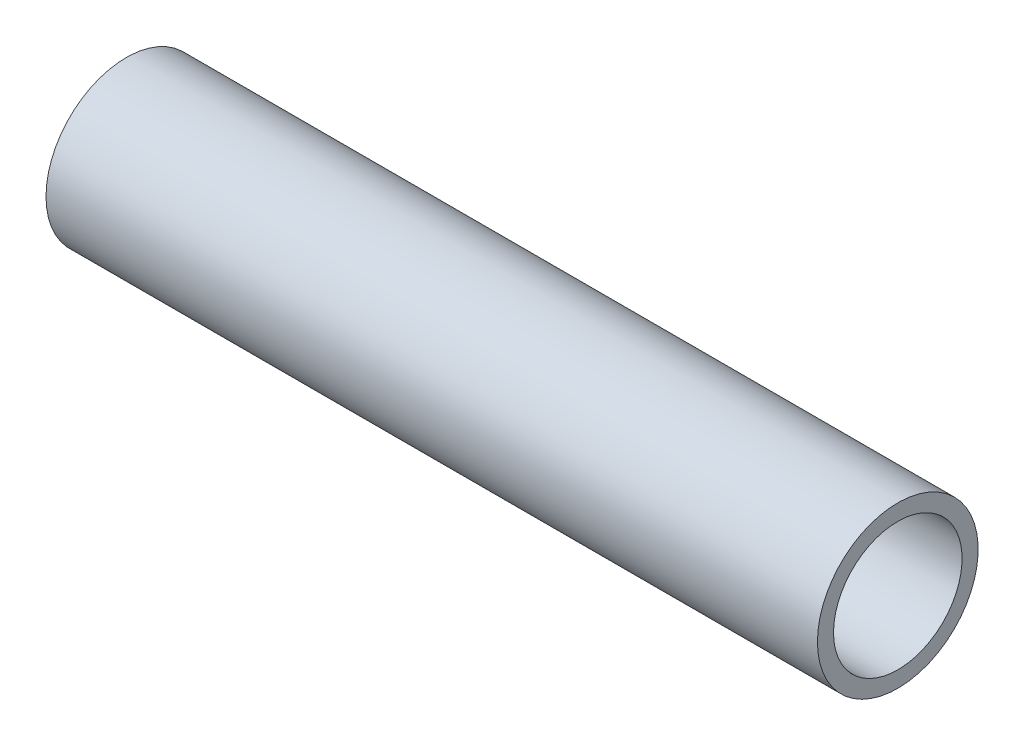
ISO-10303-21;
HEADER;
FILE_DESCRIPTION(('STEP AP214'),'2;1');
FILE_NAME('part.step','',(''),(''),'','','');
FILE_SCHEMA(('AUTOMOTIVE_DESIGN { 1 0 10303 214 1 1 1 1 }'));
ENDSEC;
DATA;
#1=APPLICATION_CONTEXT('core data for automotive mechanical design processes');
#2=APPLICATION_PROTOCOL_DEFINITION('international standard','automotive_design',2000,#1);
#3=PRODUCT_CONTEXT('',#1,'mechanical');
#4=PRODUCT('Part','Part','',(#3));
#5=PRODUCT_RELATED_PRODUCT_CATEGORY('part','',(#4));
#6=PRODUCT_DEFINITION_FORMATION('','',#4);
#7=PRODUCT_DEFINITION_CONTEXT('part definition',#1,'design');
#8=PRODUCT_DEFINITION('design','',#6,#7);
#9=PRODUCT_DEFINITION_SHAPE('','',#8);
#10=(LENGTH_UNIT() NAMED_UNIT(*) SI_UNIT(.MILLI.,.METRE.));
#11=(NAMED_UNIT(*) PLANE_ANGLE_UNIT() SI_UNIT($,.RADIAN.));
#12=(NAMED_UNIT(*) SI_UNIT($,.STERADIAN.) SOLID_ANGLE_UNIT());
#13=UNCERTAINTY_MEASURE_WITH_UNIT(LENGTH_MEASURE(1.E-05),#10,'distance_accuracy_value','');
#14=(GEOMETRIC_REPRESENTATION_CONTEXT(3) GLOBAL_UNCERTAINTY_ASSIGNED_CONTEXT((#13)) GLOBAL_UNIT_ASSIGNED_CONTEXT((#10,
#11,#12)) REPRESENTATION_CONTEXT('',''));
#15=CARTESIAN_POINT('',(0.,0.,0.));
#16=DIRECTION('',(0.,0.,1.));
#17=DIRECTION('',(1.,0.,0.));
#18=AXIS2_PLACEMENT_3D('',#15,#16,#17);
#19=CARTESIAN_POINT('',(38.1,0.,0.));
#20=DIRECTION('',(1.,0.,0.));
#21=DIRECTION('',(0.,0.,-1.));
#22=AXIS2_PLACEMENT_3D('',#19,#20,#21);
#23=PLANE('',#22);
#24=CARTESIAN_POINT('',(38.1,0.,0.));
#25=DIRECTION('',(1.,0.,0.));
#26=DIRECTION('',(0.,0.,-1.));
#27=AXIS2_PLACEMENT_3D('',#24,#25,#26);
#28=CIRCLE('',#27,7.9375);
#29=CARTESIAN_POINT('',(38.1,0.,7.9375));
#30=VERTEX_POINT('',#29);
#31=EDGE_CURVE('E10',#30,#30,#28,.T.);
#32=ORIENTED_EDGE('',*,*,#31,.T.);
#33=EDGE_LOOP('',(#32));
#34=FACE_BOUND('',#33,.T.);
#35=CARTESIAN_POINT('',(38.1,0.,0.));
#36=DIRECTION('',(1.,0.,0.));
#37=DIRECTION('',(0.,0.,-1.));
#38=AXIS2_PLACEMENT_3D('',#35,#36,#37);
#39=CIRCLE('',#38,6.35);
#40=CARTESIAN_POINT('',(38.1,0.,6.35));
#41=VERTEX_POINT('',#40);
#42=EDGE_CURVE('E54',#41,#41,#39,.T.);
#43=ORIENTED_EDGE('',*,*,#42,.F.);
#44=EDGE_LOOP('',(#43));
#45=FACE_BOUND('',#44,.T.);
#46=ADVANCED_FACE('F41',(#34,#45),#23,.T.);
#47=CARTESIAN_POINT('',(-38.1,0.,0.));
#48=DIRECTION('',(1.,0.,0.));
#49=DIRECTION('',(0.,0.,-1.));
#50=AXIS2_PLACEMENT_3D('',#47,#48,#49);
#51=PLANE('',#50);
#52=CARTESIAN_POINT('',(-38.1,0.,0.));
#53=DIRECTION('',(1.,0.,0.));
#54=DIRECTION('',(0.,0.,-1.));
#55=AXIS2_PLACEMENT_3D('',#52,#53,#54);
#56=CIRCLE('',#55,7.9375);
#57=CARTESIAN_POINT('',(-38.1,0.,7.9375));
#58=VERTEX_POINT('',#57);
#59=EDGE_CURVE('E45',#58,#58,#56,.T.);
#60=ORIENTED_EDGE('',*,*,#59,.F.);
#61=EDGE_LOOP('',(#60));
#62=FACE_BOUND('',#61,.T.);
#63=CARTESIAN_POINT('',(-38.1,0.,0.));
#64=DIRECTION('',(1.,0.,0.));
#65=DIRECTION('',(0.,0.,-1.));
#66=AXIS2_PLACEMENT_3D('',#63,#64,#65);
#67=CIRCLE('',#66,6.35);
#68=CARTESIAN_POINT('',(-38.1,0.,6.35));
#69=VERTEX_POINT('',#68);
#70=EDGE_CURVE('E56',#69,#69,#67,.T.);
#71=ORIENTED_EDGE('',*,*,#70,.T.);
#72=EDGE_LOOP('',(#71));
#73=FACE_BOUND('',#72,.T.);
#74=ADVANCED_FACE('F68',(#62,#73),#51,.F.);
#75=CARTESIAN_POINT('',(38.1,0.,0.));
#76=DIRECTION('',(-1.,0.,0.));
#77=DIRECTION('',(0.,0.,1.));
#78=AXIS2_PLACEMENT_3D('',#75,#76,#77);
#79=CYLINDRICAL_SURFACE('',#78,7.9375);
#80=CARTESIAN_POINT('',(38.1,0.,7.9375));
#81=CARTESIAN_POINT('',(37.30625,0.,7.9375));
#82=CARTESIAN_POINT('',(36.5125,0.,7.9375));
#83=CARTESIAN_POINT('',(34.925,0.,7.9375));
#84=CARTESIAN_POINT('',(34.13125,0.,7.9375));
#85=CARTESIAN_POINT('',(32.54375,0.,7.9375));
#86=CARTESIAN_POINT('',(31.75,0.,7.9375));
#87=CARTESIAN_POINT('',(30.1625,0.,7.9375));
#88=CARTESIAN_POINT('',(29.36875,0.,7.9375));
#89=CARTESIAN_POINT('',(27.78125,0.,7.9375));
#90=CARTESIAN_POINT('',(26.9875,0.,7.9375));
#91=CARTESIAN_POINT('',(25.4,0.,7.9375));
#92=CARTESIAN_POINT('',(24.60625,0.,7.9375));
#93=CARTESIAN_POINT('',(23.01875,0.,7.9375));
#94=CARTESIAN_POINT('',(22.225,0.,7.9375));
#95=CARTESIAN_POINT('',(20.6375,0.,7.9375));
#96=CARTESIAN_POINT('',(19.84375,0.,7.9375));
#97=CARTESIAN_POINT('',(18.25625,0.,7.9375));
#98=CARTESIAN_POINT('',(17.4625,0.,7.9375));
#99=CARTESIAN_POINT('',(15.875,0.,7.9375));
#100=CARTESIAN_POINT('',(15.08125,0.,7.9375));
#101=CARTESIAN_POINT('',(13.49375,0.,7.9375));
#102=CARTESIAN_POINT('',(12.7,0.,7.9375));
#103=CARTESIAN_POINT('',(11.1125,0.,7.9375));
#104=CARTESIAN_POINT('',(10.31875,0.,7.9375));
#105=CARTESIAN_POINT('',(8.73124999999999,0.,7.9375));
#106=CARTESIAN_POINT('',(7.93749999999999,0.,7.9375));
#107=CARTESIAN_POINT('',(6.34999999999999,0.,7.9375));
#108=CARTESIAN_POINT('',(5.55625,0.,7.9375));
#109=CARTESIAN_POINT('',(3.96875,0.,7.9375));
#110=CARTESIAN_POINT('',(3.17499999999999,0.,7.9375));
#111=CARTESIAN_POINT('',(1.58749999999999,0.,7.9375));
#112=CARTESIAN_POINT('',(0.793749999999994,0.,7.9375));
#113=CARTESIAN_POINT('',(-0.793750000000007,0.,7.9375));
#114=CARTESIAN_POINT('',(-1.58750000000001,0.,7.9375));
#115=CARTESIAN_POINT('',(-3.17500000000001,0.,7.9375));
#116=CARTESIAN_POINT('',(-3.96875000000001,0.,7.9375));
#117=CARTESIAN_POINT('',(-5.55625000000001,0.,7.9375));
#118=CARTESIAN_POINT('',(-6.35000000000001,0.,7.9375));
#119=CARTESIAN_POINT('',(-7.93750000000001,0.,7.9375));
#120=CARTESIAN_POINT('',(-8.73125000000001,0.,7.9375));
#121=CARTESIAN_POINT('',(-10.31875,0.,7.9375));
#122=CARTESIAN_POINT('',(-11.1125,0.,7.9375));
#123=CARTESIAN_POINT('',(-12.7,0.,7.9375));
#124=CARTESIAN_POINT('',(-13.49375,0.,7.9375));
#125=CARTESIAN_POINT('',(-15.08125,0.,7.9375));
#126=CARTESIAN_POINT('',(-15.875,0.,7.9375));
#127=CARTESIAN_POINT('',(-17.4625,0.,7.9375));
#128=CARTESIAN_POINT('',(-18.25625,0.,7.9375));
#129=CARTESIAN_POINT('',(-19.84375,0.,7.9375));
#130=CARTESIAN_POINT('',(-20.6375,0.,7.9375));
#131=CARTESIAN_POINT('',(-22.225,0.,7.9375));
#132=CARTESIAN_POINT('',(-23.01875,0.,7.9375));
#133=CARTESIAN_POINT('',(-24.60625,0.,7.9375));
#134=CARTESIAN_POINT('',(-25.4,0.,7.9375));
#135=CARTESIAN_POINT('',(-26.9875,0.,7.9375));
#136=CARTESIAN_POINT('',(-27.78125,0.,7.9375));
#137=CARTESIAN_POINT('',(-29.36875,0.,7.9375));
#138=CARTESIAN_POINT('',(-30.1625,0.,7.9375));
#139=CARTESIAN_POINT('',(-31.75,0.,7.9375));
#140=CARTESIAN_POINT('',(-32.54375,0.,7.9375));
#141=CARTESIAN_POINT('',(-34.13125,0.,7.9375));
#142=CARTESIAN_POINT('',(-34.925,0.,7.9375));
#143=CARTESIAN_POINT('',(-36.5125,0.,7.9375));
#144=CARTESIAN_POINT('',(-37.30625,0.,7.9375));
#145=CARTESIAN_POINT('',(-38.1,0.,7.9375));
#146=B_SPLINE_CURVE_WITH_KNOTS('',3,(#80,#81,#82,#83,#84,#85,#86,#87,#88,#89,#90,#91,#92,#93,
#94,#95,#96,#97,#98,#99,#100,#101,#102,#103,#104,#105,#106,#107,#108,#109,#110,#111,#112,#113,
#114,#115,#116,#117,#118,#119,#120,#121,#122,#123,#124,#125,#126,#127,#128,#129,#130,#131,#132,
#133,#134,#135,#136,#137,#138,#139,#140,#141,#142,#143,#144,#145),.UNSPECIFIED.,.F.,.F.,(4,2,2,
2,2,2,2,2,2,2,2,2,2,2,2,2,2,2,2,2,2,2,2,2,2,2,2,2,2,2,2,2,4),(0.,2.38124999999999,4.7625,
7.14375,9.525,11.90625,14.2875,16.66875,19.05,21.43125,23.8125,26.19375,28.575,30.95625,33.3375,
35.71875,38.1,40.48125,42.8625,45.24375,47.625,50.00625,52.3875,54.76875,57.15,59.53125,61.9125,
64.29375,66.675,69.05625,71.4375,73.81875,76.2),.UNSPECIFIED.);
#147=EDGE_CURVE('BSEAM43',#30,#58,#146,.T.);
#148=ORIENTED_EDGE('',*,*,#31,.F.);
#149=ORIENTED_EDGE('',*,*,#59,.T.);
#150=ORIENTED_EDGE('',*,*,#147,.T.);
#151=ORIENTED_EDGE('',*,*,#147,.F.);
#152=EDGE_LOOP('',(#148,#150,#149,#151));
#153=FACE_BOUND('',#152,.T.);
#154=ADVANCED_FACE('F43',(#153),#79,.T.);
#155=CARTESIAN_POINT('',(38.1,0.,0.));
#156=DIRECTION('',(-1.,0.,0.));
#157=DIRECTION('',(0.,0.,1.));
#158=AXIS2_PLACEMENT_3D('',#155,#156,#157);
#159=CYLINDRICAL_SURFACE('',#158,6.35);
#160=CARTESIAN_POINT('',(38.1,0.,6.35));
#161=CARTESIAN_POINT('',(37.30625,0.,6.35));
#162=CARTESIAN_POINT('',(36.5125,0.,6.35));
#163=CARTESIAN_POINT('',(34.925,0.,6.35));
#164=CARTESIAN_POINT('',(34.13125,0.,6.35));
#165=CARTESIAN_POINT('',(32.54375,0.,6.35));
#166=CARTESIAN_POINT('',(31.75,0.,6.35));
#167=CARTESIAN_POINT('',(30.1625,0.,6.35));
#168=CARTESIAN_POINT('',(29.36875,0.,6.35));
#169=CARTESIAN_POINT('',(27.78125,0.,6.35));
#170=CARTESIAN_POINT('',(26.9875,0.,6.35));
#171=CARTESIAN_POINT('',(25.4,0.,6.35));
#172=CARTESIAN_POINT('',(24.60625,0.,6.35));
#173=CARTESIAN_POINT('',(23.01875,0.,6.35));
#174=CARTESIAN_POINT('',(22.225,0.,6.35));
#175=CARTESIAN_POINT('',(20.6375,0.,6.35));
#176=CARTESIAN_POINT('',(19.84375,0.,6.35));
#177=CARTESIAN_POINT('',(18.25625,0.,6.35));
#178=CARTESIAN_POINT('',(17.4625,0.,6.35));
#179=CARTESIAN_POINT('',(15.875,0.,6.35));
#180=CARTESIAN_POINT('',(15.08125,0.,6.35));
#181=CARTESIAN_POINT('',(13.49375,0.,6.35));
#182=CARTESIAN_POINT('',(12.7,0.,6.35));
#183=CARTESIAN_POINT('',(11.1125,0.,6.35));
#184=CARTESIAN_POINT('',(10.31875,0.,6.35));
#185=CARTESIAN_POINT('',(8.73124999999999,0.,6.35));
#186=CARTESIAN_POINT('',(7.93749999999999,0.,6.35));
#187=CARTESIAN_POINT('',(6.35,0.,6.35));
#188=CARTESIAN_POINT('',(5.55625,0.,6.35));
#189=CARTESIAN_POINT('',(3.96875,0.,6.35));
#190=CARTESIAN_POINT('',(3.175,0.,6.35));
#191=CARTESIAN_POINT('',(1.5875,0.,6.35));
#192=CARTESIAN_POINT('',(0.793750000000001,0.,6.35));
#193=CARTESIAN_POINT('',(-0.793750000000001,0.,6.35));
#194=CARTESIAN_POINT('',(-1.5875,0.,6.35));
#195=CARTESIAN_POINT('',(-3.175,0.,6.35));
#196=CARTESIAN_POINT('',(-3.96875,0.,6.35));
#197=CARTESIAN_POINT('',(-5.55625,0.,6.35));
#198=CARTESIAN_POINT('',(-6.35,0.,6.35));
#199=CARTESIAN_POINT('',(-7.93750000000001,0.,6.35));
#200=CARTESIAN_POINT('',(-8.73125,0.,6.35));
#201=CARTESIAN_POINT('',(-10.31875,0.,6.35));
#202=CARTESIAN_POINT('',(-11.1125,0.,6.35));
#203=CARTESIAN_POINT('',(-12.7,0.,6.35));
#204=CARTESIAN_POINT('',(-13.49375,0.,6.35));
#205=CARTESIAN_POINT('',(-15.08125,0.,6.35));
#206=CARTESIAN_POINT('',(-15.875,0.,6.35));
#207=CARTESIAN_POINT('',(-17.4625,0.,6.35));
#208=CARTESIAN_POINT('',(-18.25625,0.,6.35));
#209=CARTESIAN_POINT('',(-19.84375,0.,6.35));
#210=CARTESIAN_POINT('',(-20.6375,0.,6.35));
#211=CARTESIAN_POINT('',(-22.225,0.,6.35));
#212=CARTESIAN_POINT('',(-23.01875,0.,6.35));
#213=CARTESIAN_POINT('',(-24.60625,0.,6.35));
#214=CARTESIAN_POINT('',(-25.4,0.,6.35));
#215=CARTESIAN_POINT('',(-26.9875,0.,6.35));
#216=CARTESIAN_POINT('',(-27.78125,0.,6.35));
#217=CARTESIAN_POINT('',(-29.36875,0.,6.35));
#218=CARTESIAN_POINT('',(-30.1625,0.,6.35));
#219=CARTESIAN_POINT('',(-31.75,0.,6.35));
#220=CARTESIAN_POINT('',(-32.54375,0.,6.35));
#221=CARTESIAN_POINT('',(-34.13125,0.,6.35));
#222=CARTESIAN_POINT('',(-34.925,0.,6.35));
#223=CARTESIAN_POINT('',(-36.5125,0.,6.35));
#224=CARTESIAN_POINT('',(-37.30625,0.,6.35));
#225=CARTESIAN_POINT('',(-38.1,0.,6.35));
#226=B_SPLINE_CURVE_WITH_KNOTS('',3,(#160,#161,#162,#163,#164,#165,#166,#167,#168,#169,#170,
#171,#172,#173,#174,#175,#176,#177,#178,#179,#180,#181,#182,#183,#184,#185,#186,#187,#188,#189,
#190,#191,#192,#193,#194,#195,#196,#197,#198,#199,#200,#201,#202,#203,#204,#205,#206,#207,#208,
#209,#210,#211,#212,#213,#214,#215,#216,#217,#218,#219,#220,#221,#222,#223,#224,#225),
.UNSPECIFIED.,.F.,.F.,(4,2,2,2,2,2,2,2,2,2,2,2,2,2,2,2,2,2,2,2,2,2,2,2,2,2,2,2,2,2,2,2,4),(0.,
2.38125,4.7625,7.14375,9.52500000000001,11.90625,14.2875,16.66875,19.05,21.43125,23.8125,
26.19375,28.575,30.95625,33.3375,35.71875,38.1,40.48125,42.8625,45.24375,47.625,50.00625,
52.3875,54.76875,57.15,59.53125,61.9125,64.29375,66.675,69.05625,71.4375,73.81875,76.2),.UNSPECIFIED.);
#227=EDGE_CURVE('BSEAM64',#41,#69,#226,.T.);
#228=ORIENTED_EDGE('',*,*,#42,.T.);
#229=ORIENTED_EDGE('',*,*,#70,.F.);
#230=ORIENTED_EDGE('',*,*,#227,.T.);
#231=ORIENTED_EDGE('',*,*,#227,.F.);
#232=EDGE_LOOP('',(#228,#230,#229,#231));
#233=FACE_BOUND('',#232,.T.);
#234=ADVANCED_FACE('F64',(#233),#159,.F.);
#235=CLOSED_SHELL('',(#46,#74,#154,#234));
#236=MANIFOLD_SOLID_BREP('B2',#235);
#237=ADVANCED_BREP_SHAPE_REPRESENTATION('',(#18,#236),#14);
#238=SHAPE_DEFINITION_REPRESENTATION(#9,#237);
ENDSEC;
END-ISO-10303-21;
